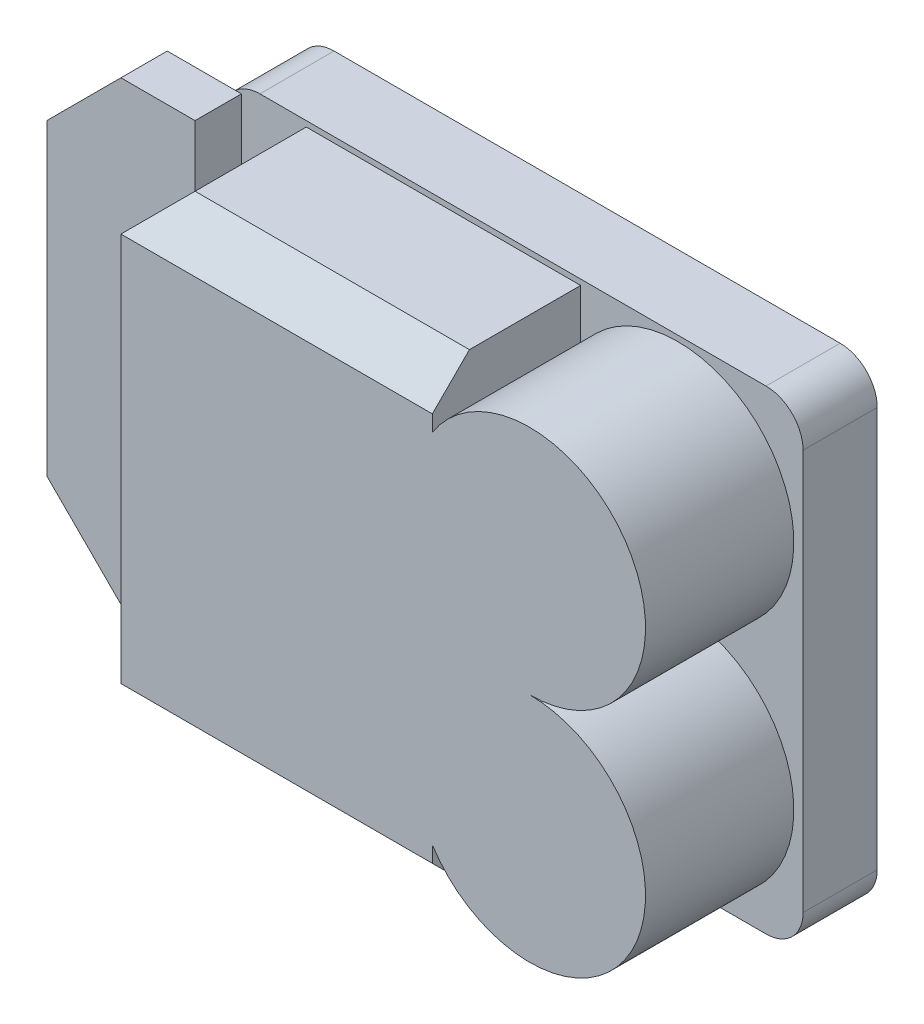
ISO-10303-21;
HEADER;
FILE_DESCRIPTION(('STEP AP214'),'2;1');
FILE_NAME('part.step','',(''),(''),'','','');
FILE_SCHEMA(('AUTOMOTIVE_DESIGN { 1 0 10303 214 1 1 1 1 }'));
ENDSEC;
DATA;
#1=APPLICATION_CONTEXT('core data for automotive mechanical design processes');
#2=APPLICATION_PROTOCOL_DEFINITION('international standard','automotive_design',2000,#1);
#3=PRODUCT_CONTEXT('',#1,'mechanical');
#4=PRODUCT('Part','Part','',(#3));
#5=PRODUCT_RELATED_PRODUCT_CATEGORY('part','',(#4));
#6=PRODUCT_DEFINITION_FORMATION('','',#4);
#7=PRODUCT_DEFINITION_CONTEXT('part definition',#1,'design');
#8=PRODUCT_DEFINITION('design','',#6,#7);
#9=PRODUCT_DEFINITION_SHAPE('','',#8);
#10=(LENGTH_UNIT() NAMED_UNIT(*) SI_UNIT(.MILLI.,.METRE.));
#11=(NAMED_UNIT(*) PLANE_ANGLE_UNIT() SI_UNIT($,.RADIAN.));
#12=(NAMED_UNIT(*) SI_UNIT($,.STERADIAN.) SOLID_ANGLE_UNIT());
#13=UNCERTAINTY_MEASURE_WITH_UNIT(LENGTH_MEASURE(1.E-05),#10,'distance_accuracy_value','');
#14=(GEOMETRIC_REPRESENTATION_CONTEXT(3) GLOBAL_UNCERTAINTY_ASSIGNED_CONTEXT((#13)) GLOBAL_UNIT_ASSIGNED_CONTEXT((#10,
#11,#12)) REPRESENTATION_CONTEXT('',''));
#15=CARTESIAN_POINT('',(0.,0.,0.));
#16=DIRECTION('',(0.,0.,1.));
#17=DIRECTION('',(1.,0.,0.));
#18=AXIS2_PLACEMENT_3D('',#15,#16,#17);
#19=CARTESIAN_POINT('',(0.,0.,0.));
#20=DIRECTION('',(0.,0.,1.));
#21=DIRECTION('',(1.,0.,0.));
#22=AXIS2_PLACEMENT_3D('',#19,#20,#21);
#23=PLANE('',#22);
#24=CARTESIAN_POINT('',(22.05,6.25,0.));
#25=DIRECTION('',(0.,0.,1.));
#26=DIRECTION('',(1.,0.,0.));
#27=AXIS2_PLACEMENT_3D('',#24,#25,#26);
#28=CIRCLE('',#27,6.25);
#29=CARTESIAN_POINT('',(16.8,2.85883500843737,0.));
#30=VERTEX_POINT('',#29);
#31=CARTESIAN_POINT('',(22.05,12.5,0.));
#32=VERTEX_POINT('',#31);
#33=EDGE_CURVE('E305',#30,#32,#28,.T.);
#34=ORIENTED_EDGE('',*,*,#33,.F.);
#35=DIRECTION('',(0.,-1.,0.));
#36=VECTOR('',#35,1.);
#37=CARTESIAN_POINT('',(16.8,0.,0.));
#38=LINE('',#37,#36);
#39=CARTESIAN_POINT('',(16.8,0.,0.));
#40=VERTEX_POINT('',#39);
#41=EDGE_CURVE('E274',#30,#40,#38,.T.);
#42=ORIENTED_EDGE('',*,*,#41,.T.);
#43=DIRECTION('',(1.,0.,0.));
#44=VECTOR('',#43,1.);
#45=CARTESIAN_POINT('',(0.,0.,0.));
#46=LINE('',#45,#44);
#47=CARTESIAN_POINT('',(1.99999999999999,0.,0.));
#48=VERTEX_POINT('',#47);
#49=EDGE_CURVE('E289',#48,#40,#46,.T.);
#50=ORIENTED_EDGE('',*,*,#49,.F.);
#51=DIRECTION('',(-0.707106781186546,0.707106781186549,0.));
#52=VECTOR('',#51,1.);
#53=CARTESIAN_POINT('',(1.99999999999999,0.,0.));
#54=LINE('',#53,#52);
#55=CARTESIAN_POINT('',(0.,2.,0.));
#56=VERTEX_POINT('',#55);
#57=EDGE_CURVE('E62',#48,#56,#54,.T.);
#58=ORIENTED_EDGE('',*,*,#57,.T.);
#59=DIRECTION('',(0.,1.,0.));
#60=VECTOR('',#59,1.);
#61=CARTESIAN_POINT('',(0.,0.,0.));
#62=LINE('',#61,#60);
#63=CARTESIAN_POINT('',(0.,23.,0.));
#64=VERTEX_POINT('',#63);
#65=EDGE_CURVE('E312',#56,#64,#62,.T.);
#66=ORIENTED_EDGE('',*,*,#65,.T.);
#67=DIRECTION('',(-0.707106781186549,-0.707106781186546,0.));
#68=VECTOR('',#67,1.);
#69=CARTESIAN_POINT('',(0.,23.,0.));
#70=LINE('',#69,#68);
#71=CARTESIAN_POINT('',(2.,25.,0.));
#72=VERTEX_POINT('',#71);
#73=EDGE_CURVE('E11',#64,#72,#70,.F.);
#74=ORIENTED_EDGE('',*,*,#73,.T.);
#75=DIRECTION('',(1.,0.,0.));
#76=VECTOR('',#75,1.);
#77=CARTESIAN_POINT('',(0.,25.,0.));
#78=LINE('',#77,#76);
#79=CARTESIAN_POINT('',(16.8,25.,0.));
#80=VERTEX_POINT('',#79);
#81=EDGE_CURVE('E309',#72,#80,#78,.T.);
#82=ORIENTED_EDGE('',*,*,#81,.T.);
#83=DIRECTION('',(0.,-1.,0.));
#84=VECTOR('',#83,1.);
#85=CARTESIAN_POINT('',(16.8,0.,0.));
#86=LINE('',#85,#84);
#87=CARTESIAN_POINT('',(16.8,22.1411649915626,0.));
#88=VERTEX_POINT('',#87);
#89=EDGE_CURVE('E308',#80,#88,#86,.T.);
#90=ORIENTED_EDGE('',*,*,#89,.T.);
#91=CARTESIAN_POINT('',(22.05,18.75,0.));
#92=DIRECTION('',(0.,0.,1.));
#93=DIRECTION('',(1.,0.,0.));
#94=AXIS2_PLACEMENT_3D('',#91,#92,#93);
#95=CIRCLE('',#94,6.25);
#96=EDGE_CURVE('E304',#32,#88,#95,.T.);
#97=ORIENTED_EDGE('',*,*,#96,.F.);
#98=EDGE_LOOP('',(#34,#42,#50,#58,#66,#74,#82,#90,#97));
#99=FACE_BOUND('',#98,.T.);
#100=DIRECTION('',(0.,-1.,0.));
#101=VECTOR('',#100,1.);
#102=CARTESIAN_POINT('',(28.8,25.3,0.));
#103=LINE('',#102,#101);
#104=CARTESIAN_POINT('',(28.8,23.3,0.));
#105=VERTEX_POINT('',#104);
#106=CARTESIAN_POINT('',(28.8,1.7,0.));
#107=VERTEX_POINT('',#106);
#108=EDGE_CURVE('E278',#105,#107,#103,.T.);
#109=ORIENTED_EDGE('',*,*,#108,.F.);
#110=CARTESIAN_POINT('',(26.8,23.3,0.));
#111=DIRECTION('',(0.,0.,1.));
#112=DIRECTION('',(1.,0.,0.));
#113=AXIS2_PLACEMENT_3D('',#110,#111,#112);
#114=CIRCLE('',#113,2.);
#115=CARTESIAN_POINT('',(26.8,25.3,0.));
#116=VERTEX_POINT('',#115);
#117=EDGE_CURVE('E360',#105,#116,#114,.T.);
#118=ORIENTED_EDGE('',*,*,#117,.T.);
#119=DIRECTION('',(1.,0.,0.));
#120=VECTOR('',#119,1.);
#121=CARTESIAN_POINT('',(-2.5,25.3,0.));
#122=LINE('',#121,#120);
#123=CARTESIAN_POINT('',(-0.5,25.3,0.));
#124=VERTEX_POINT('',#123);
#125=EDGE_CURVE('E280',#124,#116,#122,.T.);
#126=ORIENTED_EDGE('',*,*,#125,.F.);
#127=CARTESIAN_POINT('',(-0.5,23.3,0.));
#128=DIRECTION('',(0.,0.,1.));
#129=DIRECTION('',(1.,0.,0.));
#130=AXIS2_PLACEMENT_3D('',#127,#128,#129);
#131=CIRCLE('',#130,2.);
#132=CARTESIAN_POINT('',(-1.82287565553229,24.8,0.));
#133=VERTEX_POINT('',#132);
#134=EDGE_CURVE('E355',#124,#133,#131,.T.);
#135=ORIENTED_EDGE('',*,*,#134,.T.);
#136=DIRECTION('',(-1.,0.,0.));
#137=VECTOR('',#136,1.);
#138=CARTESIAN_POINT('',(-1.5,24.8,0.));
#139=LINE('',#138,#137);
#140=CARTESIAN_POINT('',(-1.5,24.8,0.));
#141=VERTEX_POINT('',#140);
#142=EDGE_CURVE('E251',#141,#133,#139,.T.);
#143=ORIENTED_EDGE('',*,*,#142,.F.);
#144=DIRECTION('',(0.,-1.,0.));
#145=VECTOR('',#144,1.);
#146=CARTESIAN_POINT('',(-1.5,24.8,0.));
#147=LINE('',#146,#145);
#148=CARTESIAN_POINT('',(-1.5,0.2,0.));
#149=VERTEX_POINT('',#148);
#150=EDGE_CURVE('E246',#141,#149,#147,.T.);
#151=ORIENTED_EDGE('',*,*,#150,.T.);
#152=DIRECTION('',(-1.,0.,0.));
#153=VECTOR('',#152,1.);
#154=CARTESIAN_POINT('',(-1.5,0.2,0.));
#155=LINE('',#154,#153);
#156=CARTESIAN_POINT('',(-1.8228756555323,0.2,0.));
#157=VERTEX_POINT('',#156);
#158=EDGE_CURVE('E234',#149,#157,#155,.T.);
#159=ORIENTED_EDGE('',*,*,#158,.T.);
#160=CARTESIAN_POINT('',(-0.500000000000003,1.7,0.));
#161=DIRECTION('',(0.,0.,1.));
#162=DIRECTION('',(1.,0.,0.));
#163=AXIS2_PLACEMENT_3D('',#160,#161,#162);
#164=CIRCLE('',#163,2.);
#165=CARTESIAN_POINT('',(-0.500000000000003,-0.3,0.));
#166=VERTEX_POINT('',#165);
#167=EDGE_CURVE('E352',#157,#166,#164,.T.);
#168=ORIENTED_EDGE('',*,*,#167,.T.);
#169=DIRECTION('',(-1.,0.,0.));
#170=VECTOR('',#169,1.);
#171=CARTESIAN_POINT('',(-2.5,-0.3,0.));
#172=LINE('',#171,#170);
#173=CARTESIAN_POINT('',(26.8,-0.300000000000004,0.));
#174=VERTEX_POINT('',#173);
#175=EDGE_CURVE('E264',#174,#166,#172,.T.);
#176=ORIENTED_EDGE('',*,*,#175,.F.);
#177=CARTESIAN_POINT('',(26.8,1.7,0.));
#178=DIRECTION('',(0.,0.,1.));
#179=DIRECTION('',(1.,0.,0.));
#180=AXIS2_PLACEMENT_3D('',#177,#178,#179);
#181=CIRCLE('',#180,2.);
#182=EDGE_CURVE('E357',#174,#107,#181,.T.);
#183=ORIENTED_EDGE('',*,*,#182,.T.);
#184=EDGE_LOOP('',(#109,#118,#126,#135,#143,#151,#159,#168,#176,#183));
#185=FACE_BOUND('',#184,.T.);
#186=ADVANCED_FACE('F51',(#99,#185),#23,.T.);
#187=CARTESIAN_POINT('',(16.8,0.,8.));
#188=DIRECTION('',(1.,0.,0.));
#189=DIRECTION('',(0.,1.,0.));
#190=AXIS2_PLACEMENT_3D('',#187,#188,#189);
#191=PLANE('',#190);
#192=DIRECTION('',(0.,-1.,0.));
#193=VECTOR('',#192,1.);
#194=CARTESIAN_POINT('',(16.8,0.,8.));
#195=LINE('',#194,#193);
#196=CARTESIAN_POINT('',(16.8,2.85883500843737,8.));
#197=VERTEX_POINT('',#196);
#198=CARTESIAN_POINT('',(16.8,2.,8.));
#199=VERTEX_POINT('',#198);
#200=EDGE_CURVE('E284',#197,#199,#195,.T.);
#201=ORIENTED_EDGE('',*,*,#200,.T.);
#202=DIRECTION('',(0.,-0.707106781186549,-0.707106781186546));
#203=VECTOR('',#202,1.);
#204=CARTESIAN_POINT('',(16.8,0.999999999999999,7.));
#205=LINE('',#204,#203);
#206=CARTESIAN_POINT('',(16.8,0.,6.00000000000001));
#207=VERTEX_POINT('',#206);
#208=EDGE_CURVE('E392',#199,#207,#205,.T.);
#209=ORIENTED_EDGE('',*,*,#208,.T.);
#210=DIRECTION('',(0.,0.,-1.));
#211=VECTOR('',#210,1.);
#212=CARTESIAN_POINT('',(16.8,0.,8.));
#213=LINE('',#212,#211);
#214=EDGE_CURVE('E299',#207,#40,#213,.T.);
#215=ORIENTED_EDGE('',*,*,#214,.T.);
#216=ORIENTED_EDGE('',*,*,#41,.F.);
#217=DIRECTION('',(0.,0.,-1.));
#218=VECTOR('',#217,1.);
#219=CARTESIAN_POINT('',(16.8,2.85883500843737,8.));
#220=LINE('',#219,#218);
#221=EDGE_CURVE('E330',#197,#30,#220,.T.);
#222=ORIENTED_EDGE('',*,*,#221,.F.);
#223=EDGE_LOOP('',(#201,#209,#215,#216,#222));
#224=FACE_BOUND('',#223,.T.);
#225=ADVANCED_FACE('F459',(#224),#191,.T.);
#226=CARTESIAN_POINT('',(22.05,6.25,8.));
#227=DIRECTION('',(0.,0.,-1.));
#228=DIRECTION('',(-1.,0.,0.));
#229=AXIS2_PLACEMENT_3D('',#226,#227,#228);
#230=CYLINDRICAL_SURFACE('',#229,6.25);
#231=ORIENTED_EDGE('',*,*,#33,.T.);
#232=DIRECTION('',(0.,0.,-1.));
#233=VECTOR('',#232,1.);
#234=CARTESIAN_POINT('',(22.05,12.5,8.));
#235=LINE('',#234,#233);
#236=CARTESIAN_POINT('',(22.05,12.5,8.));
#237=VERTEX_POINT('',#236);
#238=EDGE_CURVE('E321',#237,#32,#235,.T.);
#239=ORIENTED_EDGE('',*,*,#238,.F.);
#240=CARTESIAN_POINT('',(22.05,6.25,8.));
#241=DIRECTION('',(0.,0.,1.));
#242=DIRECTION('',(1.,0.,0.));
#243=AXIS2_PLACEMENT_3D('',#240,#241,#242);
#244=CIRCLE('',#243,6.25);
#245=EDGE_CURVE('E286',#197,#237,#244,.T.);
#246=ORIENTED_EDGE('',*,*,#245,.F.);
#247=ORIENTED_EDGE('',*,*,#221,.T.);
#248=EDGE_LOOP('',(#231,#239,#246,#247));
#249=FACE_BOUND('',#248,.T.);
#250=ADVANCED_FACE('F449',(#249),#230,.T.);
#251=CARTESIAN_POINT('',(22.05,18.75,8.));
#252=DIRECTION('',(0.,0.,-1.));
#253=DIRECTION('',(-1.,0.,0.));
#254=AXIS2_PLACEMENT_3D('',#251,#252,#253);
#255=CYLINDRICAL_SURFACE('',#254,6.25);
#256=ORIENTED_EDGE('',*,*,#96,.T.);
#257=DIRECTION('',(0.,0.,-1.));
#258=VECTOR('',#257,1.);
#259=CARTESIAN_POINT('',(16.8,22.1411649915626,8.));
#260=LINE('',#259,#258);
#261=CARTESIAN_POINT('',(16.8,22.1411649915626,8.));
#262=VERTEX_POINT('',#261);
#263=EDGE_CURVE('E322',#262,#88,#260,.T.);
#264=ORIENTED_EDGE('',*,*,#263,.F.);
#265=CARTESIAN_POINT('',(22.05,18.75,8.));
#266=DIRECTION('',(0.,0.,1.));
#267=DIRECTION('',(1.,0.,0.));
#268=AXIS2_PLACEMENT_3D('',#265,#266,#267);
#269=CIRCLE('',#268,6.25);
#270=EDGE_CURVE('E293',#237,#262,#269,.T.);
#271=ORIENTED_EDGE('',*,*,#270,.F.);
#272=ORIENTED_EDGE('',*,*,#238,.T.);
#273=EDGE_LOOP('',(#256,#264,#271,#272));
#274=FACE_BOUND('',#273,.T.);
#275=ADVANCED_FACE('F452',(#274),#255,.T.);
#276=CARTESIAN_POINT('',(16.8,0.,8.));
#277=DIRECTION('',(1.,0.,0.));
#278=DIRECTION('',(0.,1.,0.));
#279=AXIS2_PLACEMENT_3D('',#276,#277,#278);
#280=PLANE('',#279);
#281=DIRECTION('',(0.,0.,-1.));
#282=VECTOR('',#281,1.);
#283=CARTESIAN_POINT('',(16.8,25.,8.));
#284=LINE('',#283,#282);
#285=CARTESIAN_POINT('',(16.8,25.,6.));
#286=VERTEX_POINT('',#285);
#287=EDGE_CURVE('E316',#286,#80,#284,.T.);
#288=ORIENTED_EDGE('',*,*,#287,.F.);
#289=DIRECTION('',(0.,0.707106781186546,-0.707106781186549));
#290=VECTOR('',#289,1.);
#291=CARTESIAN_POINT('',(16.8,11.5,19.5));
#292=LINE('',#291,#290);
#293=CARTESIAN_POINT('',(16.8,23.,8.));
#294=VERTEX_POINT('',#293);
#295=EDGE_CURVE('E80',#286,#294,#292,.F.);
#296=ORIENTED_EDGE('',*,*,#295,.T.);
#297=DIRECTION('',(0.,-1.,0.));
#298=VECTOR('',#297,1.);
#299=CARTESIAN_POINT('',(16.8,0.,8.));
#300=LINE('',#299,#298);
#301=EDGE_CURVE('E295',#294,#262,#300,.T.);
#302=ORIENTED_EDGE('',*,*,#301,.T.);
#303=ORIENTED_EDGE('',*,*,#263,.T.);
#304=ORIENTED_EDGE('',*,*,#89,.F.);
#305=EDGE_LOOP('',(#288,#296,#302,#303,#304));
#306=FACE_BOUND('',#305,.T.);
#307=ADVANCED_FACE('F445',(#306),#280,.T.);
#308=CARTESIAN_POINT('',(0.,25.,8.));
#309=DIRECTION('',(0.,1.,0.));
#310=DIRECTION('',(0.,0.,1.));
#311=AXIS2_PLACEMENT_3D('',#308,#309,#310);
#312=PLANE('',#311);
#313=DIRECTION('',(0.,0.,1.));
#314=VECTOR('',#313,1.);
#315=CARTESIAN_POINT('',(2.,25.,8.));
#316=LINE('',#315,#314);
#317=CARTESIAN_POINT('',(2.,25.,6.));
#318=VERTEX_POINT('',#317);
#319=EDGE_CURVE('E67',#72,#318,#316,.T.);
#320=ORIENTED_EDGE('',*,*,#319,.T.);
#321=DIRECTION('',(1.,0.,0.));
#322=VECTOR('',#321,1.);
#323=CARTESIAN_POINT('',(0.,25.,6.));
#324=LINE('',#323,#322);
#325=EDGE_CURVE('E403',#318,#286,#324,.T.);
#326=ORIENTED_EDGE('',*,*,#325,.T.);
#327=ORIENTED_EDGE('',*,*,#287,.T.);
#328=ORIENTED_EDGE('',*,*,#81,.F.);
#329=EDGE_LOOP('',(#320,#326,#327,#328));
#330=FACE_BOUND('',#329,.T.);
#331=ADVANCED_FACE('F443',(#330),#312,.T.);
#332=CARTESIAN_POINT('',(0.,0.,8.));
#333=DIRECTION('',(-1.,0.,0.));
#334=DIRECTION('',(0.,0.,1.));
#335=AXIS2_PLACEMENT_3D('',#332,#333,#334);
#336=PLANE('',#335);
#337=ORIENTED_EDGE('',*,*,#65,.F.);
#338=DIRECTION('',(0.,0.,1.));
#339=VECTOR('',#338,1.);
#340=CARTESIAN_POINT('',(0.,2.,8.));
#341=LINE('',#340,#339);
#342=CARTESIAN_POINT('',(0.,2.,8.));
#343=VERTEX_POINT('',#342);
#344=EDGE_CURVE('E405',#56,#343,#341,.T.);
#345=ORIENTED_EDGE('',*,*,#344,.T.);
#346=DIRECTION('',(0.,1.,0.));
#347=VECTOR('',#346,1.);
#348=CARTESIAN_POINT('',(0.,0.,8.));
#349=LINE('',#348,#347);
#350=CARTESIAN_POINT('',(0.,23.,8.));
#351=VERTEX_POINT('',#350);
#352=EDGE_CURVE('E298',#343,#351,#349,.T.);
#353=ORIENTED_EDGE('',*,*,#352,.T.);
#354=DIRECTION('',(0.,0.,-1.));
#355=VECTOR('',#354,1.);
#356=CARTESIAN_POINT('',(0.,23.,8.));
#357=LINE('',#356,#355);
#358=EDGE_CURVE('E397',#351,#64,#357,.T.);
#359=ORIENTED_EDGE('',*,*,#358,.T.);
#360=EDGE_LOOP('',(#337,#345,#353,#359));
#361=FACE_BOUND('',#360,.T.);
#362=ADVANCED_FACE('F425',(#361),#336,.T.);
#363=CARTESIAN_POINT('',(0.,0.,8.));
#364=DIRECTION('',(0.,1.,0.));
#365=DIRECTION('',(0.,0.,1.));
#366=AXIS2_PLACEMENT_3D('',#363,#364,#365);
#367=PLANE('',#366);
#368=ORIENTED_EDGE('',*,*,#214,.F.);
#369=DIRECTION('',(-1.,0.,0.));
#370=VECTOR('',#369,1.);
#371=CARTESIAN_POINT('',(0.,0.,6.00000000000001));
#372=LINE('',#371,#370);
#373=CARTESIAN_POINT('',(1.99999999999999,0.,6.00000000000001));
#374=VERTEX_POINT('',#373);
#375=EDGE_CURVE('E396',#207,#374,#372,.T.);
#376=ORIENTED_EDGE('',*,*,#375,.T.);
#377=DIRECTION('',(0.,0.,-1.));
#378=VECTOR('',#377,1.);
#379=CARTESIAN_POINT('',(1.99999999999999,0.,0.));
#380=LINE('',#379,#378);
#381=EDGE_CURVE('E398',#374,#48,#380,.T.);
#382=ORIENTED_EDGE('',*,*,#381,.T.);
#383=ORIENTED_EDGE('',*,*,#49,.T.);
#384=EDGE_LOOP('',(#368,#376,#382,#383));
#385=FACE_BOUND('',#384,.T.);
#386=ADVANCED_FACE('F495',(#385),#367,.F.);
#387=CARTESIAN_POINT('',(0.,0.,8.));
#388=DIRECTION('',(0.,0.,1.));
#389=DIRECTION('',(1.,0.,0.));
#390=AXIS2_PLACEMENT_3D('',#387,#388,#389);
#391=PLANE('',#390);
#392=ORIENTED_EDGE('',*,*,#352,.F.);
#393=DIRECTION('',(1.,0.,0.));
#394=VECTOR('',#393,1.);
#395=CARTESIAN_POINT('',(16.8,2.,8.));
#396=LINE('',#395,#394);
#397=EDGE_CURVE('E391',#343,#199,#396,.T.);
#398=ORIENTED_EDGE('',*,*,#397,.T.);
#399=ORIENTED_EDGE('',*,*,#200,.F.);
#400=ORIENTED_EDGE('',*,*,#245,.T.);
#401=ORIENTED_EDGE('',*,*,#270,.T.);
#402=ORIENTED_EDGE('',*,*,#301,.F.);
#403=DIRECTION('',(-1.,0.,0.));
#404=VECTOR('',#403,1.);
#405=CARTESIAN_POINT('',(0.,23.,8.));
#406=LINE('',#405,#404);
#407=EDGE_CURVE('E386',#294,#351,#406,.T.);
#408=ORIENTED_EDGE('',*,*,#407,.T.);
#409=EDGE_LOOP('',(#392,#398,#399,#400,#401,#402,#408));
#410=FACE_BOUND('',#409,.T.);
#411=ADVANCED_FACE('F434',(#410),#391,.T.);
#412=CARTESIAN_POINT('',(-2.5,25.3,-4.));
#413=DIRECTION('',(1.,0.,0.));
#414=DIRECTION('',(0.,1.,0.));
#415=AXIS2_PLACEMENT_3D('',#412,#413,#414);
#416=PLANE('',#415);
#417=DIRECTION('',(0.,1.,0.));
#418=VECTOR('',#417,1.);
#419=CARTESIAN_POINT('',(-2.5,25.3,-4.));
#420=LINE('',#419,#418);
#421=CARTESIAN_POINT('',(-2.5,1.7,-4.));
#422=VERTEX_POINT('',#421);
#423=CARTESIAN_POINT('',(-2.5,23.3,-4.));
#424=VERTEX_POINT('',#423);
#425=EDGE_CURVE('E261',#422,#424,#420,.T.);
#426=ORIENTED_EDGE('',*,*,#425,.F.);
#427=DIRECTION('',(0.,0.,1.));
#428=VECTOR('',#427,1.);
#429=CARTESIAN_POINT('',(-2.5,1.7,-4.));
#430=LINE('',#429,#428);
#431=CARTESIAN_POINT('',(-2.5,1.7,0.));
#432=VERTEX_POINT('',#431);
#433=EDGE_CURVE('E382',#422,#432,#430,.T.);
#434=ORIENTED_EDGE('',*,*,#433,.T.);
#435=DIRECTION('',(0.,1.,0.));
#436=VECTOR('',#435,1.);
#437=CARTESIAN_POINT('',(-2.5,25.3,0.));
#438=LINE('',#437,#436);
#439=CARTESIAN_POINT('',(-2.5,23.3,0.));
#440=VERTEX_POINT('',#439);
#441=EDGE_CURVE('E260',#432,#440,#438,.T.);
#442=ORIENTED_EDGE('',*,*,#441,.T.);
#443=DIRECTION('',(0.,0.,1.));
#444=VECTOR('',#443,1.);
#445=CARTESIAN_POINT('',(-2.5,23.3,-4.));
#446=LINE('',#445,#444);
#447=EDGE_CURVE('E378',#440,#424,#446,.F.);
#448=ORIENTED_EDGE('',*,*,#447,.T.);
#449=EDGE_LOOP('',(#426,#434,#442,#448));
#450=FACE_BOUND('',#449,.T.);
#451=ADVANCED_FACE('F482',(#450),#416,.F.);
#452=CARTESIAN_POINT('',(-2.5,25.3,-4.));
#453=DIRECTION('',(0.,-1.,0.));
#454=DIRECTION('',(1.,0.,0.));
#455=AXIS2_PLACEMENT_3D('',#452,#453,#454);
#456=PLANE('',#455);
#457=ORIENTED_EDGE('',*,*,#125,.T.);
#458=DIRECTION('',(0.,0.,1.));
#459=VECTOR('',#458,1.);
#460=CARTESIAN_POINT('',(26.8,25.3,-4.));
#461=LINE('',#460,#459);
#462=CARTESIAN_POINT('',(26.8,25.3,-4.));
#463=VERTEX_POINT('',#462);
#464=EDGE_CURVE('E364',#116,#463,#461,.F.);
#465=ORIENTED_EDGE('',*,*,#464,.T.);
#466=DIRECTION('',(1.,0.,0.));
#467=VECTOR('',#466,1.);
#468=CARTESIAN_POINT('',(-2.5,25.3,-4.));
#469=LINE('',#468,#467);
#470=CARTESIAN_POINT('',(-0.5,25.3,-4.));
#471=VERTEX_POINT('',#470);
#472=EDGE_CURVE('E262',#471,#463,#469,.T.);
#473=ORIENTED_EDGE('',*,*,#472,.F.);
#474=DIRECTION('',(0.,0.,1.));
#475=VECTOR('',#474,1.);
#476=CARTESIAN_POINT('',(-0.5,25.3,-4.));
#477=LINE('',#476,#475);
#478=EDGE_CURVE('E363',#471,#124,#477,.T.);
#479=ORIENTED_EDGE('',*,*,#478,.T.);
#480=EDGE_LOOP('',(#457,#465,#473,#479));
#481=FACE_BOUND('',#480,.T.);
#482=ADVANCED_FACE('F483',(#481),#456,.F.);
#483=CARTESIAN_POINT('',(28.8,25.3,-4.));
#484=DIRECTION('',(-1.,0.,0.));
#485=DIRECTION('',(0.,-1.,0.));
#486=AXIS2_PLACEMENT_3D('',#483,#484,#485);
#487=PLANE('',#486);
#488=DIRECTION('',(0.,-1.,0.));
#489=VECTOR('',#488,1.);
#490=CARTESIAN_POINT('',(28.8,25.3,-4.));
#491=LINE('',#490,#489);
#492=CARTESIAN_POINT('',(28.8,23.3,-4.));
#493=VERTEX_POINT('',#492);
#494=CARTESIAN_POINT('',(28.8,1.7,-4.));
#495=VERTEX_POINT('',#494);
#496=EDGE_CURVE('E266',#493,#495,#491,.T.);
#497=ORIENTED_EDGE('',*,*,#496,.F.);
#498=DIRECTION('',(0.,0.,1.));
#499=VECTOR('',#498,1.);
#500=CARTESIAN_POINT('',(28.8,23.3,-4.));
#501=LINE('',#500,#499);
#502=EDGE_CURVE('E347',#493,#105,#501,.T.);
#503=ORIENTED_EDGE('',*,*,#502,.T.);
#504=ORIENTED_EDGE('',*,*,#108,.T.);
#505=DIRECTION('',(0.,0.,1.));
#506=VECTOR('',#505,1.);
#507=CARTESIAN_POINT('',(28.8,1.7,-4.));
#508=LINE('',#507,#506);
#509=EDGE_CURVE('E350',#107,#495,#508,.F.);
#510=ORIENTED_EDGE('',*,*,#509,.T.);
#511=EDGE_LOOP('',(#497,#503,#504,#510));
#512=FACE_BOUND('',#511,.T.);
#513=ADVANCED_FACE('F480',(#512),#487,.F.);
#514=CARTESIAN_POINT('',(-2.5,-0.3,-4.));
#515=DIRECTION('',(0.,1.,0.));
#516=DIRECTION('',(-1.,0.,0.));
#517=AXIS2_PLACEMENT_3D('',#514,#515,#516);
#518=PLANE('',#517);
#519=DIRECTION('',(-1.,0.,0.));
#520=VECTOR('',#519,1.);
#521=CARTESIAN_POINT('',(-2.5,-0.3,-4.));
#522=LINE('',#521,#520);
#523=CARTESIAN_POINT('',(26.8,-0.300000000000004,-4.));
#524=VERTEX_POINT('',#523);
#525=CARTESIAN_POINT('',(-0.500000000000003,-0.3,-4.));
#526=VERTEX_POINT('',#525);
#527=EDGE_CURVE('E272',#524,#526,#522,.T.);
#528=ORIENTED_EDGE('',*,*,#527,.F.);
#529=DIRECTION('',(0.,0.,1.));
#530=VECTOR('',#529,1.);
#531=CARTESIAN_POINT('',(26.8,-0.300000000000004,-4.));
#532=LINE('',#531,#530);
#533=EDGE_CURVE('E376',#524,#174,#532,.T.);
#534=ORIENTED_EDGE('',*,*,#533,.T.);
#535=ORIENTED_EDGE('',*,*,#175,.T.);
#536=DIRECTION('',(0.,0.,1.));
#537=VECTOR('',#536,1.);
#538=CARTESIAN_POINT('',(-0.500000000000003,-0.3,-4.));
#539=LINE('',#538,#537);
#540=EDGE_CURVE('E372',#166,#526,#539,.F.);
#541=ORIENTED_EDGE('',*,*,#540,.T.);
#542=EDGE_LOOP('',(#528,#534,#535,#541));
#543=FACE_BOUND('',#542,.T.);
#544=ADVANCED_FACE('F471',(#543),#518,.F.);
#545=CARTESIAN_POINT('',(0.,0.,-4.));
#546=DIRECTION('',(0.,0.,1.));
#547=DIRECTION('',(1.,0.,0.));
#548=AXIS2_PLACEMENT_3D('',#545,#546,#547);
#549=PLANE('',#548);
#550=ORIENTED_EDGE('',*,*,#472,.T.);
#551=CARTESIAN_POINT('',(26.8,23.3,-4.));
#552=DIRECTION('',(0.,0.,1.));
#553=DIRECTION('',(1.,0.,0.));
#554=AXIS2_PLACEMENT_3D('',#551,#552,#553);
#555=CIRCLE('',#554,2.);
#556=EDGE_CURVE('E375',#463,#493,#555,.F.);
#557=ORIENTED_EDGE('',*,*,#556,.T.);
#558=ORIENTED_EDGE('',*,*,#496,.T.);
#559=CARTESIAN_POINT('',(26.8,1.7,-4.));
#560=DIRECTION('',(0.,0.,1.));
#561=DIRECTION('',(1.,0.,0.));
#562=AXIS2_PLACEMENT_3D('',#559,#560,#561);
#563=CIRCLE('',#562,2.);
#564=EDGE_CURVE('E369',#495,#524,#563,.F.);
#565=ORIENTED_EDGE('',*,*,#564,.T.);
#566=ORIENTED_EDGE('',*,*,#527,.T.);
#567=CARTESIAN_POINT('',(-0.500000000000003,1.7,-4.));
#568=DIRECTION('',(0.,0.,1.));
#569=DIRECTION('',(1.,0.,0.));
#570=AXIS2_PLACEMENT_3D('',#567,#568,#569);
#571=CIRCLE('',#570,2.);
#572=EDGE_CURVE('E368',#526,#422,#571,.F.);
#573=ORIENTED_EDGE('',*,*,#572,.T.);
#574=ORIENTED_EDGE('',*,*,#425,.T.);
#575=CARTESIAN_POINT('',(-0.5,23.3,-4.));
#576=DIRECTION('',(0.,0.,1.));
#577=DIRECTION('',(1.,0.,0.));
#578=AXIS2_PLACEMENT_3D('',#575,#576,#577);
#579=CIRCLE('',#578,2.);
#580=EDGE_CURVE('E366',#424,#471,#579,.F.);
#581=ORIENTED_EDGE('',*,*,#580,.T.);
#582=EDGE_LOOP('',(#550,#557,#558,#565,#566,#573,#574,#581));
#583=FACE_BOUND('',#582,.T.);
#584=ADVANCED_FACE('F475',(#583),#549,.F.);
#585=CARTESIAN_POINT('',(-1.5,24.8,0.));
#586=DIRECTION('',(0.,0.,-1.));
#587=DIRECTION('',(0.,1.,0.));
#588=AXIS2_PLACEMENT_3D('',#585,#586,#587);
#589=PLANE('',#588);
#590=CARTESIAN_POINT('',(-5.49999999999998,0.200000000000001,0.));
#591=VERTEX_POINT('',#590);
#592=EDGE_CURVE('E254',#157,#591,#155,.T.);
#593=ORIENTED_EDGE('',*,*,#592,.T.);
#594=DIRECTION('',(0.707106781186548,-0.707106781186547,0.));
#595=VECTOR('',#594,1.);
#596=CARTESIAN_POINT('',(-15.8,10.5,0.));
#597=LINE('',#596,#595);
#598=CARTESIAN_POINT('',(-9.5,4.20000000000002,0.));
#599=VERTEX_POINT('',#598);
#600=EDGE_CURVE('E344',#591,#599,#597,.F.);
#601=ORIENTED_EDGE('',*,*,#600,.T.);
#602=DIRECTION('',(0.,-1.,0.));
#603=VECTOR('',#602,1.);
#604=CARTESIAN_POINT('',(-9.5,24.8,0.));
#605=LINE('',#604,#603);
#606=CARTESIAN_POINT('',(-9.5,20.8,0.));
#607=VERTEX_POINT('',#606);
#608=EDGE_CURVE('E408',#607,#599,#605,.T.);
#609=ORIENTED_EDGE('',*,*,#608,.F.);
#610=DIRECTION('',(-0.707106781186549,-0.707106781186546,0.));
#611=VECTOR('',#610,1.);
#612=CARTESIAN_POINT('',(-3.49999999999999,26.8,0.));
#613=LINE('',#612,#611);
#614=CARTESIAN_POINT('',(-5.49999999999999,24.8,0.));
#615=VERTEX_POINT('',#614);
#616=EDGE_CURVE('E342',#607,#615,#613,.F.);
#617=ORIENTED_EDGE('',*,*,#616,.T.);
#618=EDGE_CURVE('E259',#133,#615,#139,.T.);
#619=ORIENTED_EDGE('',*,*,#618,.F.);
#620=CARTESIAN_POINT('',(-0.5,23.3,0.));
#621=DIRECTION('',(0.,0.,-1.));
#622=DIRECTION('',(0.,1.,0.));
#623=AXIS2_PLACEMENT_3D('',#620,#621,#622);
#624=CIRCLE('',#623,2.);
#625=EDGE_CURVE('E390',#133,#440,#624,.F.);
#626=ORIENTED_EDGE('',*,*,#625,.T.);
#627=ORIENTED_EDGE('',*,*,#441,.F.);
#628=CARTESIAN_POINT('',(-0.500000000000003,1.7,0.));
#629=DIRECTION('',(0.,0.,-1.));
#630=DIRECTION('',(0.,1.,0.));
#631=AXIS2_PLACEMENT_3D('',#628,#629,#630);
#632=CIRCLE('',#631,2.);
#633=EDGE_CURVE('E381',#432,#157,#632,.F.);
#634=ORIENTED_EDGE('',*,*,#633,.T.);
#635=EDGE_LOOP('',(#593,#601,#609,#617,#619,#626,#627,#634));
#636=FACE_BOUND('',#635,.T.);
#637=ADVANCED_FACE('F512',(#636),#589,.T.);
#638=CARTESIAN_POINT('',(-1.5,24.8,0.));
#639=DIRECTION('',(0.,1.,0.));
#640=DIRECTION('',(-1.,0.,0.));
#641=AXIS2_PLACEMENT_3D('',#638,#639,#640);
#642=PLANE('',#641);
#643=ORIENTED_EDGE('',*,*,#618,.T.);
#644=DIRECTION('',(0.,0.,1.));
#645=VECTOR('',#644,1.);
#646=CARTESIAN_POINT('',(-5.49999999999999,24.8,0.));
#647=LINE('',#646,#645);
#648=CARTESIAN_POINT('',(-5.49999999999999,24.8,2.5));
#649=VERTEX_POINT('',#648);
#650=EDGE_CURVE('E343',#615,#649,#647,.T.);
#651=ORIENTED_EDGE('',*,*,#650,.T.);
#652=DIRECTION('',(-1.,0.,0.));
#653=VECTOR('',#652,1.);
#654=CARTESIAN_POINT('',(-1.5,24.8,2.5));
#655=LINE('',#654,#653);
#656=CARTESIAN_POINT('',(-1.5,24.8,2.5));
#657=VERTEX_POINT('',#656);
#658=EDGE_CURVE('E231',#657,#649,#655,.T.);
#659=ORIENTED_EDGE('',*,*,#658,.F.);
#660=DIRECTION('',(0.,0.,-1.));
#661=VECTOR('',#660,1.);
#662=CARTESIAN_POINT('',(-1.5,24.8,0.));
#663=LINE('',#662,#661);
#664=EDGE_CURVE('E241',#657,#141,#663,.T.);
#665=ORIENTED_EDGE('',*,*,#664,.T.);
#666=ORIENTED_EDGE('',*,*,#142,.T.);
#667=EDGE_LOOP('',(#643,#651,#659,#665,#666));
#668=FACE_BOUND('',#667,.T.);
#669=ADVANCED_FACE('F545',(#668),#642,.T.);
#670=CARTESIAN_POINT('',(-1.5,24.8,2.5));
#671=DIRECTION('',(0.,0.,1.));
#672=DIRECTION('',(0.,-1.,0.));
#673=AXIS2_PLACEMENT_3D('',#670,#671,#672);
#674=PLANE('',#673);
#675=DIRECTION('',(0.,1.,0.));
#676=VECTOR('',#675,1.);
#677=CARTESIAN_POINT('',(-9.5,24.8,2.5));
#678=LINE('',#677,#676);
#679=CARTESIAN_POINT('',(-9.5,4.20000000000002,2.5));
#680=VERTEX_POINT('',#679);
#681=CARTESIAN_POINT('',(-9.5,20.8,2.5));
#682=VERTEX_POINT('',#681);
#683=EDGE_CURVE('E247',#680,#682,#678,.T.);
#684=ORIENTED_EDGE('',*,*,#683,.F.);
#685=DIRECTION('',(-0.707106781186548,0.707106781186547,0.));
#686=VECTOR('',#685,1.);
#687=CARTESIAN_POINT('',(-15.8,10.5,2.5));
#688=LINE('',#687,#686);
#689=CARTESIAN_POINT('',(-5.49999999999998,0.200000000000001,2.5));
#690=VERTEX_POINT('',#689);
#691=EDGE_CURVE('E230',#680,#690,#688,.F.);
#692=ORIENTED_EDGE('',*,*,#691,.T.);
#693=DIRECTION('',(-1.,0.,0.));
#694=VECTOR('',#693,1.);
#695=CARTESIAN_POINT('',(-1.5,0.2,2.5));
#696=LINE('',#695,#694);
#697=CARTESIAN_POINT('',(-1.5,0.2,2.5));
#698=VERTEX_POINT('',#697);
#699=EDGE_CURVE('E225',#698,#690,#696,.T.);
#700=ORIENTED_EDGE('',*,*,#699,.F.);
#701=DIRECTION('',(0.,1.,0.));
#702=VECTOR('',#701,1.);
#703=CARTESIAN_POINT('',(-1.5,24.8,2.5));
#704=LINE('',#703,#702);
#705=EDGE_CURVE('E227',#698,#657,#704,.T.);
#706=ORIENTED_EDGE('',*,*,#705,.T.);
#707=ORIENTED_EDGE('',*,*,#658,.T.);
#708=DIRECTION('',(0.707106781186549,0.707106781186546,0.));
#709=VECTOR('',#708,1.);
#710=CARTESIAN_POINT('',(-3.49999999999999,26.8,2.5));
#711=LINE('',#710,#709);
#712=EDGE_CURVE('E337',#649,#682,#711,.F.);
#713=ORIENTED_EDGE('',*,*,#712,.T.);
#714=EDGE_LOOP('',(#684,#692,#700,#706,#707,#713));
#715=FACE_BOUND('',#714,.T.);
#716=ADVANCED_FACE('F222',(#715),#674,.T.);
#717=CARTESIAN_POINT('',(-1.5,0.2,0.));
#718=DIRECTION('',(0.,-1.,0.));
#719=DIRECTION('',(1.,0.,0.));
#720=AXIS2_PLACEMENT_3D('',#717,#718,#719);
#721=PLANE('',#720);
#722=ORIENTED_EDGE('',*,*,#699,.T.);
#723=DIRECTION('',(0.,0.,-1.));
#724=VECTOR('',#723,1.);
#725=CARTESIAN_POINT('',(-5.49999999999998,0.200000000000001,0.));
#726=LINE('',#725,#724);
#727=EDGE_CURVE('E339',#690,#591,#726,.T.);
#728=ORIENTED_EDGE('',*,*,#727,.T.);
#729=ORIENTED_EDGE('',*,*,#592,.F.);
#730=ORIENTED_EDGE('',*,*,#158,.F.);
#731=DIRECTION('',(0.,0.,1.));
#732=VECTOR('',#731,1.);
#733=CARTESIAN_POINT('',(-1.5,0.2,0.));
#734=LINE('',#733,#732);
#735=EDGE_CURVE('E238',#149,#698,#734,.T.);
#736=ORIENTED_EDGE('',*,*,#735,.T.);
#737=EDGE_LOOP('',(#722,#728,#729,#730,#736));
#738=FACE_BOUND('',#737,.T.);
#739=ADVANCED_FACE('F243',(#738),#721,.T.);
#740=CARTESIAN_POINT('',(-1.5,0.,0.));
#741=DIRECTION('',(-1.,0.,0.));
#742=DIRECTION('',(0.,-1.,0.));
#743=AXIS2_PLACEMENT_3D('',#740,#741,#742);
#744=PLANE('',#743);
#745=ORIENTED_EDGE('',*,*,#150,.F.);
#746=ORIENTED_EDGE('',*,*,#664,.F.);
#747=ORIENTED_EDGE('',*,*,#705,.F.);
#748=ORIENTED_EDGE('',*,*,#735,.F.);
#749=EDGE_LOOP('',(#745,#746,#747,#748));
#750=FACE_BOUND('',#749,.T.);
#751=ADVANCED_FACE('F240',(#750),#744,.F.);
#752=CARTESIAN_POINT('',(-9.5,0.,0.));
#753=DIRECTION('',(-1.,0.,0.));
#754=DIRECTION('',(0.,-1.,0.));
#755=AXIS2_PLACEMENT_3D('',#752,#753,#754);
#756=PLANE('',#755);
#757=ORIENTED_EDGE('',*,*,#608,.T.);
#758=DIRECTION('',(0.,0.,1.));
#759=VECTOR('',#758,1.);
#760=CARTESIAN_POINT('',(-9.5,4.20000000000001,0.));
#761=LINE('',#760,#759);
#762=EDGE_CURVE('E331',#599,#680,#761,.T.);
#763=ORIENTED_EDGE('',*,*,#762,.T.);
#764=ORIENTED_EDGE('',*,*,#683,.T.);
#765=DIRECTION('',(0.,0.,-1.));
#766=VECTOR('',#765,1.);
#767=CARTESIAN_POINT('',(-9.5,20.8,0.));
#768=LINE('',#767,#766);
#769=EDGE_CURVE('E329',#682,#607,#768,.T.);
#770=ORIENTED_EDGE('',*,*,#769,.T.);
#771=EDGE_LOOP('',(#757,#763,#764,#770));
#772=FACE_BOUND('',#771,.T.);
#773=ADVANCED_FACE('F648',(#772),#756,.T.);
#774=CARTESIAN_POINT('',(-9.5,4.20000000000001,0.));
#775=DIRECTION('',(0.707106781186547,0.707106781186548,0.));
#776=DIRECTION('',(0.,0.,1.));
#777=AXIS2_PLACEMENT_3D('',#774,#775,#776);
#778=PLANE('',#777);
#779=ORIENTED_EDGE('',*,*,#600,.F.);
#780=ORIENTED_EDGE('',*,*,#727,.F.);
#781=ORIENTED_EDGE('',*,*,#691,.F.);
#782=ORIENTED_EDGE('',*,*,#762,.F.);
#783=EDGE_LOOP('',(#779,#780,#781,#782));
#784=FACE_BOUND('',#783,.T.);
#785=ADVANCED_FACE('F643',(#784),#778,.F.);
#786=CARTESIAN_POINT('',(-9.5,20.8,0.));
#787=DIRECTION('',(0.707106781186546,-0.707106781186549,0.));
#788=DIRECTION('',(0.,0.,-1.));
#789=AXIS2_PLACEMENT_3D('',#786,#787,#788);
#790=PLANE('',#789);
#791=ORIENTED_EDGE('',*,*,#712,.F.);
#792=ORIENTED_EDGE('',*,*,#650,.F.);
#793=ORIENTED_EDGE('',*,*,#616,.F.);
#794=ORIENTED_EDGE('',*,*,#769,.F.);
#795=EDGE_LOOP('',(#791,#792,#793,#794));
#796=FACE_BOUND('',#795,.T.);
#797=ADVANCED_FACE('F566',(#796),#790,.F.);
#798=CARTESIAN_POINT('',(26.8,23.3,-4.));
#799=DIRECTION('',(0.,0.,1.));
#800=DIRECTION('',(1.,0.,0.));
#801=AXIS2_PLACEMENT_3D('',#798,#799,#800);
#802=CYLINDRICAL_SURFACE('',#801,2.);
#803=ORIENTED_EDGE('',*,*,#556,.F.);
#804=ORIENTED_EDGE('',*,*,#464,.F.);
#805=ORIENTED_EDGE('',*,*,#117,.F.);
#806=ORIENTED_EDGE('',*,*,#502,.F.);
#807=EDGE_LOOP('',(#803,#804,#805,#806));
#808=FACE_BOUND('',#807,.T.);
#809=ADVANCED_FACE('F561',(#808),#802,.T.);
#810=CARTESIAN_POINT('',(26.8,1.7,-4.));
#811=DIRECTION('',(0.,0.,1.));
#812=DIRECTION('',(1.,0.,0.));
#813=AXIS2_PLACEMENT_3D('',#810,#811,#812);
#814=CYLINDRICAL_SURFACE('',#813,2.);
#815=ORIENTED_EDGE('',*,*,#564,.F.);
#816=ORIENTED_EDGE('',*,*,#509,.F.);
#817=ORIENTED_EDGE('',*,*,#182,.F.);
#818=ORIENTED_EDGE('',*,*,#533,.F.);
#819=EDGE_LOOP('',(#815,#816,#817,#818));
#820=FACE_BOUND('',#819,.T.);
#821=ADVANCED_FACE('F564',(#820),#814,.T.);
#822=CARTESIAN_POINT('',(-0.500000000000003,1.7,-4.));
#823=DIRECTION('',(0.,0.,1.));
#824=DIRECTION('',(1.,0.,0.));
#825=AXIS2_PLACEMENT_3D('',#822,#823,#824);
#826=CYLINDRICAL_SURFACE('',#825,2.);
#827=ORIENTED_EDGE('',*,*,#572,.F.);
#828=ORIENTED_EDGE('',*,*,#540,.F.);
#829=ORIENTED_EDGE('',*,*,#167,.F.);
#830=ORIENTED_EDGE('',*,*,#633,.F.);
#831=ORIENTED_EDGE('',*,*,#433,.F.);
#832=EDGE_LOOP('',(#827,#828,#829,#830,#831));
#833=FACE_BOUND('',#832,.T.);
#834=ADVANCED_FACE('F577',(#833),#826,.T.);
#835=CARTESIAN_POINT('',(-0.5,23.3,-4.));
#836=DIRECTION('',(0.,0.,1.));
#837=DIRECTION('',(1.,0.,0.));
#838=AXIS2_PLACEMENT_3D('',#835,#836,#837);
#839=CYLINDRICAL_SURFACE('',#838,2.);
#840=ORIENTED_EDGE('',*,*,#580,.F.);
#841=ORIENTED_EDGE('',*,*,#447,.F.);
#842=ORIENTED_EDGE('',*,*,#625,.F.);
#843=ORIENTED_EDGE('',*,*,#134,.F.);
#844=ORIENTED_EDGE('',*,*,#478,.F.);
#845=EDGE_LOOP('',(#840,#841,#842,#843,#844));
#846=FACE_BOUND('',#845,.T.);
#847=ADVANCED_FACE('F581',(#846),#839,.T.);
#848=CARTESIAN_POINT('',(1.99999999999999,0.,8.));
#849=DIRECTION('',(-0.707106781186549,-0.707106781186546,0.));
#850=DIRECTION('',(0.,0.,1.));
#851=AXIS2_PLACEMENT_3D('',#848,#849,#850);
#852=PLANE('',#851);
#853=ORIENTED_EDGE('',*,*,#57,.F.);
#854=ORIENTED_EDGE('',*,*,#381,.F.);
#855=DIRECTION('',(-0.577350269189625,0.577350269189627,0.577350269189625));
#856=VECTOR('',#855,1.);
#857=CARTESIAN_POINT('',(1.33333333333333,0.666666666666666,6.66666666666667));
#858=LINE('',#857,#856);
#859=EDGE_CURVE('E409',#343,#374,#858,.F.);
#860=ORIENTED_EDGE('',*,*,#859,.F.);
#861=ORIENTED_EDGE('',*,*,#344,.F.);
#862=EDGE_LOOP('',(#853,#854,#860,#861));
#863=FACE_BOUND('',#862,.T.);
#864=ADVANCED_FACE('F433',(#863),#852,.T.);
#865=CARTESIAN_POINT('',(0.,2.,8.));
#866=DIRECTION('',(0.,-0.707106781186546,0.707106781186549));
#867=DIRECTION('',(-1.,0.,0.));
#868=AXIS2_PLACEMENT_3D('',#865,#866,#867);
#869=PLANE('',#868);
#870=ORIENTED_EDGE('',*,*,#859,.T.);
#871=ORIENTED_EDGE('',*,*,#375,.F.);
#872=ORIENTED_EDGE('',*,*,#208,.F.);
#873=ORIENTED_EDGE('',*,*,#397,.F.);
#874=EDGE_LOOP('',(#870,#871,#872,#873));
#875=FACE_BOUND('',#874,.T.);
#876=ADVANCED_FACE('F601',(#875),#869,.T.);
#877=CARTESIAN_POINT('',(0.,23.,8.));
#878=DIRECTION('',(0.707106781186546,-0.707106781186549,0.));
#879=DIRECTION('',(0.,0.,-1.));
#880=AXIS2_PLACEMENT_3D('',#877,#878,#879);
#881=PLANE('',#880);
#882=ORIENTED_EDGE('',*,*,#73,.F.);
#883=ORIENTED_EDGE('',*,*,#358,.F.);
#884=DIRECTION('',(0.577350269189627,0.577350269189624,-0.577350269189627));
#885=VECTOR('',#884,1.);
#886=CARTESIAN_POINT('',(0.,23.,8.));
#887=LINE('',#886,#885);
#888=EDGE_CURVE('E57',#318,#351,#887,.F.);
#889=ORIENTED_EDGE('',*,*,#888,.F.);
#890=ORIENTED_EDGE('',*,*,#319,.F.);
#891=EDGE_LOOP('',(#882,#883,#889,#890));
#892=FACE_BOUND('',#891,.T.);
#893=ADVANCED_FACE('F53',(#892),#881,.F.);
#894=CARTESIAN_POINT('',(0.,25.,6.));
#895=DIRECTION('',(0.,-0.707106781186549,-0.707106781186546));
#896=DIRECTION('',(1.,0.,0.));
#897=AXIS2_PLACEMENT_3D('',#894,#895,#896);
#898=PLANE('',#897);
#899=ORIENTED_EDGE('',*,*,#888,.T.);
#900=ORIENTED_EDGE('',*,*,#407,.F.);
#901=ORIENTED_EDGE('',*,*,#295,.F.);
#902=ORIENTED_EDGE('',*,*,#325,.F.);
#903=EDGE_LOOP('',(#899,#900,#901,#902));
#904=FACE_BOUND('',#903,.T.);
#905=ADVANCED_FACE('F416',(#904),#898,.F.);
#906=CLOSED_SHELL('',(#186,#225,#250,#275,#307,#331,#362,#386,#411,#451,#482,#513,#544,#584,
#637,#669,#716,#739,#751,#773,#785,#797,#809,#821,#834,#847,#864,#876,#893,#905));
#907=MANIFOLD_SOLID_BREP('B2',#906);
#908=ADVANCED_BREP_SHAPE_REPRESENTATION('',(#18,#907),#14);
#909=SHAPE_DEFINITION_REPRESENTATION(#9,#908);
ENDSEC;
END-ISO-10303-21;
